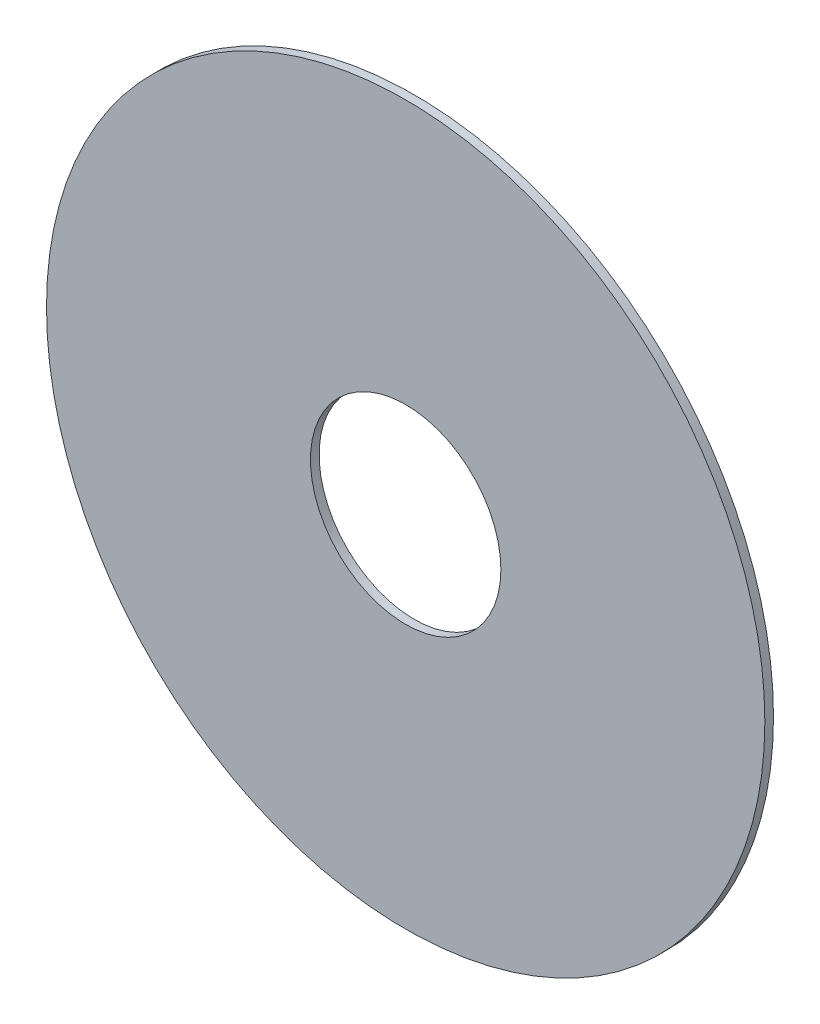
ISO-10303-21;
HEADER;
FILE_DESCRIPTION(('STEP AP214'),'2;1');
FILE_NAME('part.step','',(''),(''),'','','');
FILE_SCHEMA(('AUTOMOTIVE_DESIGN { 1 0 10303 214 1 1 1 1 }'));
ENDSEC;
DATA;
#1=APPLICATION_CONTEXT('core data for automotive mechanical design processes');
#2=APPLICATION_PROTOCOL_DEFINITION('international standard','automotive_design',2000,#1);
#3=PRODUCT_CONTEXT('',#1,'mechanical');
#4=PRODUCT('Part','Part','',(#3));
#5=PRODUCT_RELATED_PRODUCT_CATEGORY('part','',(#4));
#6=PRODUCT_DEFINITION_FORMATION('','',#4);
#7=PRODUCT_DEFINITION_CONTEXT('part definition',#1,'design');
#8=PRODUCT_DEFINITION('design','',#6,#7);
#9=PRODUCT_DEFINITION_SHAPE('','',#8);
#10=(LENGTH_UNIT() NAMED_UNIT(*) SI_UNIT(.MILLI.,.METRE.));
#11=(NAMED_UNIT(*) PLANE_ANGLE_UNIT() SI_UNIT($,.RADIAN.));
#12=(NAMED_UNIT(*) SI_UNIT($,.STERADIAN.) SOLID_ANGLE_UNIT());
#13=UNCERTAINTY_MEASURE_WITH_UNIT(LENGTH_MEASURE(1.E-05),#10,'distance_accuracy_value','');
#14=(GEOMETRIC_REPRESENTATION_CONTEXT(3) GLOBAL_UNCERTAINTY_ASSIGNED_CONTEXT((#13)) GLOBAL_UNIT_ASSIGNED_CONTEXT((#10,
#11,#12)) REPRESENTATION_CONTEXT('',''));
#15=CARTESIAN_POINT('',(0.,0.,0.));
#16=DIRECTION('',(0.,0.,1.));
#17=DIRECTION('',(1.,0.,0.));
#18=AXIS2_PLACEMENT_3D('',#15,#16,#17);
#19=CARTESIAN_POINT('',(-196.078642011159,135.377138865125,271.));
#20=DIRECTION('',(0.,0.,1.));
#21=DIRECTION('',(1.,0.,0.));
#22=AXIS2_PLACEMENT_3D('',#19,#20,#21);
#23=PLANE('',#22);
#24=CARTESIAN_POINT('',(-196.078642011159,135.377138865125,271.));
#25=DIRECTION('',(0.,0.,1.));
#26=DIRECTION('',(1.,0.,0.));
#27=AXIS2_PLACEMENT_3D('',#24,#25,#26);
#28=CIRCLE('',#27,41.5);
#29=CARTESIAN_POINT('',(-154.578642011159,135.377138865125,271.));
#30=VERTEX_POINT('',#29);
#31=EDGE_CURVE('E10',#30,#30,#28,.T.);
#32=ORIENTED_EDGE('',*,*,#31,.T.);
#33=EDGE_LOOP('',(#32));
#34=FACE_BOUND('',#33,.T.);
#35=CARTESIAN_POINT('',(-196.078642011159,135.377138865125,271.));
#36=DIRECTION('',(0.,0.,1.));
#37=DIRECTION('',(1.,0.,0.));
#38=AXIS2_PLACEMENT_3D('',#35,#36,#37);
#39=CIRCLE('',#38,11.);
#40=CARTESIAN_POINT('',(-185.078642011159,135.377138865125,271.));
#41=VERTEX_POINT('',#40);
#42=EDGE_CURVE('E48',#41,#41,#39,.T.);
#43=ORIENTED_EDGE('',*,*,#42,.F.);
#44=EDGE_LOOP('',(#43));
#45=FACE_BOUND('',#44,.T.);
#46=ADVANCED_FACE('F37',(#34,#45),#23,.T.);
#47=CARTESIAN_POINT('',(-196.078642011159,135.377138865125,270.));
#48=DIRECTION('',(0.,0.,1.));
#49=DIRECTION('',(1.,0.,0.));
#50=AXIS2_PLACEMENT_3D('',#47,#48,#49);
#51=PLANE('',#50);
#52=CARTESIAN_POINT('',(-196.078642011159,135.377138865125,270.));
#53=DIRECTION('',(0.,0.,1.));
#54=DIRECTION('',(1.,0.,0.));
#55=AXIS2_PLACEMENT_3D('',#52,#53,#54);
#56=CIRCLE('',#55,41.5);
#57=CARTESIAN_POINT('',(-154.578642011159,135.377138865125,270.));
#58=VERTEX_POINT('',#57);
#59=EDGE_CURVE('E41',#58,#58,#56,.T.);
#60=ORIENTED_EDGE('',*,*,#59,.F.);
#61=EDGE_LOOP('',(#60));
#62=FACE_BOUND('',#61,.T.);
#63=CARTESIAN_POINT('',(-196.078642011159,135.377138865125,270.));
#64=DIRECTION('',(0.,0.,1.));
#65=DIRECTION('',(1.,0.,0.));
#66=AXIS2_PLACEMENT_3D('',#63,#64,#65);
#67=CIRCLE('',#66,11.);
#68=CARTESIAN_POINT('',(-185.078642011159,135.377138865125,270.));
#69=VERTEX_POINT('',#68);
#70=EDGE_CURVE('E50',#69,#69,#67,.T.);
#71=ORIENTED_EDGE('',*,*,#70,.T.);
#72=EDGE_LOOP('',(#71));
#73=FACE_BOUND('',#72,.T.);
#74=ADVANCED_FACE('F60',(#62,#73),#51,.F.);
#75=CARTESIAN_POINT('',(-196.078642011159,135.377138865125,271.));
#76=DIRECTION('',(0.,0.,-1.));
#77=DIRECTION('',(-1.,0.,0.));
#78=AXIS2_PLACEMENT_3D('',#75,#76,#77);
#79=CYLINDRICAL_SURFACE('',#78,41.5);
#80=ORIENTED_EDGE('',*,*,#31,.F.);
#81=EDGE_LOOP('',(#80));
#82=FACE_BOUND('',#81,.T.);
#83=ORIENTED_EDGE('',*,*,#59,.T.);
#84=EDGE_LOOP('',(#83));
#85=FACE_BOUND('',#84,.T.);
#86=ADVANCED_FACE('F39',(#82,#85),#79,.T.);
#87=CARTESIAN_POINT('',(-196.078642011159,135.377138865125,271.));
#88=DIRECTION('',(0.,0.,-1.));
#89=DIRECTION('',(-1.,0.,0.));
#90=AXIS2_PLACEMENT_3D('',#87,#88,#89);
#91=CYLINDRICAL_SURFACE('',#90,11.);
#92=ORIENTED_EDGE('',*,*,#42,.T.);
#93=EDGE_LOOP('',(#92));
#94=FACE_BOUND('',#93,.T.);
#95=ORIENTED_EDGE('',*,*,#70,.F.);
#96=EDGE_LOOP('',(#95));
#97=FACE_BOUND('',#96,.T.);
#98=ADVANCED_FACE('F56',(#94,#97),#91,.F.);
#99=CLOSED_SHELL('',(#46,#74,#86,#98));
#100=MANIFOLD_SOLID_BREP('B2',#99);
#101=ADVANCED_BREP_SHAPE_REPRESENTATION('',(#18,#100),#14);
#102=SHAPE_DEFINITION_REPRESENTATION(#9,#101);
ENDSEC;
END-ISO-10303-21;
